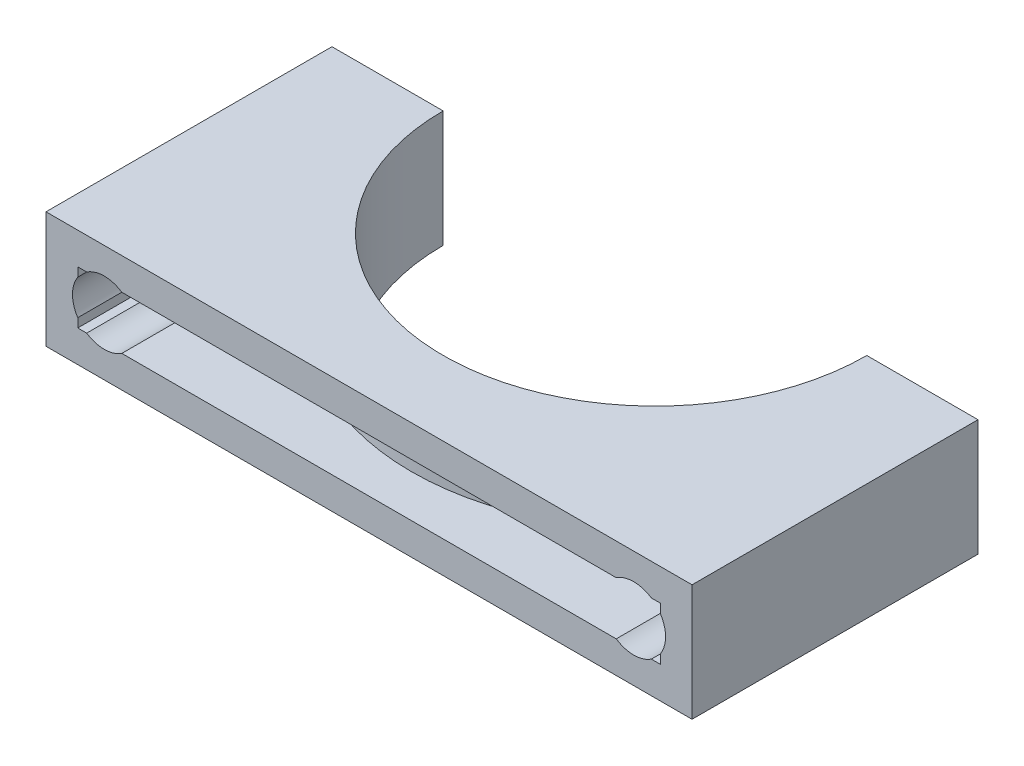
ISO-10303-21;
HEADER;
FILE_DESCRIPTION(('STEP AP214'),'2;1');
FILE_NAME('part.step','',(''),(''),'','','');
FILE_SCHEMA(('AUTOMOTIVE_DESIGN { 1 0 10303 214 1 1 1 1 }'));
ENDSEC;
DATA;
#1=APPLICATION_CONTEXT('core data for automotive mechanical design processes');
#2=APPLICATION_PROTOCOL_DEFINITION('international standard','automotive_design',2000,#1);
#3=PRODUCT_CONTEXT('',#1,'mechanical');
#4=PRODUCT('Part','Part','',(#3));
#5=PRODUCT_RELATED_PRODUCT_CATEGORY('part','',(#4));
#6=PRODUCT_DEFINITION_FORMATION('','',#4);
#7=PRODUCT_DEFINITION_CONTEXT('part definition',#1,'design');
#8=PRODUCT_DEFINITION('design','',#6,#7);
#9=PRODUCT_DEFINITION_SHAPE('','',#8);
#10=(LENGTH_UNIT() NAMED_UNIT(*) SI_UNIT(.MILLI.,.METRE.));
#11=(NAMED_UNIT(*) PLANE_ANGLE_UNIT() SI_UNIT($,.RADIAN.));
#12=(NAMED_UNIT(*) SI_UNIT($,.STERADIAN.) SOLID_ANGLE_UNIT());
#13=UNCERTAINTY_MEASURE_WITH_UNIT(LENGTH_MEASURE(1.E-05),#10,'distance_accuracy_value','');
#14=(GEOMETRIC_REPRESENTATION_CONTEXT(3) GLOBAL_UNCERTAINTY_ASSIGNED_CONTEXT((#13)) GLOBAL_UNIT_ASSIGNED_CONTEXT((#10,
#11,#12)) REPRESENTATION_CONTEXT('',''));
#15=CARTESIAN_POINT('',(0.,0.,0.));
#16=DIRECTION('',(0.,0.,1.));
#17=DIRECTION('',(1.,0.,0.));
#18=AXIS2_PLACEMENT_3D('',#15,#16,#17);
#19=CARTESIAN_POINT('',(-13.75,-2.75,-5.25));
#20=DIRECTION('',(0.,0.,1.));
#21=DIRECTION('',(1.,0.,0.));
#22=AXIS2_PLACEMENT_3D('',#19,#20,#21);
#23=PLANE('',#22);
#24=DIRECTION('',(1.,0.,0.));
#25=VECTOR('',#24,1.);
#26=CARTESIAN_POINT('',(13.75,-1.25,-5.25));
#27=LINE('',#26,#25);
#28=CARTESIAN_POINT('',(-11.4017542509914,-1.25,-5.25));
#29=VERTEX_POINT('',#28);
#30=CARTESIAN_POINT('',(-11.6708438024111,-1.24999999999999,-5.25));
#31=VERTEX_POINT('',#30);
#32=EDGE_CURVE('E430',#29,#31,#27,.F.);
#33=ORIENTED_EDGE('',*,*,#32,.F.);
#34=DIRECTION('',(0.,1.,0.));
#35=VECTOR('',#34,1.);
#36=CARTESIAN_POINT('',(-11.4017542509914,-2.75,-5.25));
#37=LINE('',#36,#35);
#38=CARTESIAN_POINT('',(-11.4017542509914,-1.02169284757431,-5.25));
#39=VERTEX_POINT('',#38);
#40=EDGE_CURVE('E483',#39,#29,#37,.F.);
#41=ORIENTED_EDGE('',*,*,#40,.F.);
#42=CARTESIAN_POINT('',(-12.5,0.,-5.25));
#43=DIRECTION('',(0.,0.,1.));
#44=DIRECTION('',(1.,0.,0.));
#45=AXIS2_PLACEMENT_3D('',#42,#43,#44);
#46=CIRCLE('',#45,1.5);
#47=EDGE_CURVE('E428',#39,#31,#46,.F.);
#48=ORIENTED_EDGE('',*,*,#47,.T.);
#49=EDGE_LOOP('',(#33,#41,#48));
#50=FACE_BOUND('',#49,.T.);
#51=ADVANCED_FACE('F16',(#50),#23,.T.);
#52=CARTESIAN_POINT('',(13.75,-1.25,-6.75));
#53=DIRECTION('',(0.,1.,0.));
#54=DIRECTION('',(0.,0.,1.));
#55=AXIS2_PLACEMENT_3D('',#52,#53,#54);
#56=PLANE('',#55);
#57=DIRECTION('',(0.,0.,-1.));
#58=VECTOR('',#57,1.);
#59=CARTESIAN_POINT('',(-13.75,-1.25,5.25));
#60=LINE('',#59,#58);
#61=CARTESIAN_POINT('',(-13.75,-1.25,6.75));
#62=VERTEX_POINT('',#61);
#63=CARTESIAN_POINT('',(-13.75,-1.25,-5.25));
#64=VERTEX_POINT('',#63);
#65=EDGE_CURVE('E180',#62,#64,#60,.T.);
#66=ORIENTED_EDGE('',*,*,#65,.F.);
#67=DIRECTION('',(1.,0.,0.));
#68=VECTOR('',#67,1.);
#69=CARTESIAN_POINT('',(13.75,-1.25,6.75));
#70=LINE('',#69,#68);
#71=CARTESIAN_POINT('',(-13.3291561975889,-1.24999999999999,6.75));
#72=VERTEX_POINT('',#71);
#73=EDGE_CURVE('E194',#62,#72,#70,.T.);
#74=ORIENTED_EDGE('',*,*,#73,.T.);
#75=DIRECTION('',(0.,0.,1.));
#76=VECTOR('',#75,1.);
#77=CARTESIAN_POINT('',(-13.3291561975889,-1.24999999999998,-6.75));
#78=LINE('',#77,#76);
#79=CARTESIAN_POINT('',(-13.3291561975889,-1.24999999999999,-5.25));
#80=VERTEX_POINT('',#79);
#81=EDGE_CURVE('E427',#72,#80,#78,.F.);
#82=ORIENTED_EDGE('',*,*,#81,.T.);
#83=DIRECTION('',(1.,0.,0.));
#84=VECTOR('',#83,1.);
#85=CARTESIAN_POINT('',(-13.75,-1.25,-5.25));
#86=LINE('',#85,#84);
#87=EDGE_CURVE('E191',#64,#80,#86,.T.);
#88=ORIENTED_EDGE('',*,*,#87,.F.);
#89=EDGE_LOOP('',(#66,#74,#82,#88));
#90=FACE_BOUND('',#89,.T.);
#91=ADVANCED_FACE('F204',(#90),#56,.T.);
#92=CARTESIAN_POINT('',(-13.75,-2.75,-5.25));
#93=DIRECTION('',(0.,0.,1.));
#94=DIRECTION('',(1.,0.,0.));
#95=AXIS2_PLACEMENT_3D('',#92,#93,#94);
#96=PLANE('',#95);
#97=DIRECTION('',(0.,1.,0.));
#98=VECTOR('',#97,1.);
#99=CARTESIAN_POINT('',(-13.75,-2.75,-5.25));
#100=LINE('',#99,#98);
#101=CARTESIAN_POINT('',(-13.75,-0.829156197588849,-5.25));
#102=VERTEX_POINT('',#101);
#103=EDGE_CURVE('E206',#64,#102,#100,.T.);
#104=ORIENTED_EDGE('',*,*,#103,.F.);
#105=ORIENTED_EDGE('',*,*,#87,.T.);
#106=CARTESIAN_POINT('',(-12.5,0.,-5.25));
#107=DIRECTION('',(0.,0.,1.));
#108=DIRECTION('',(1.,0.,0.));
#109=AXIS2_PLACEMENT_3D('',#106,#107,#108);
#110=CIRCLE('',#109,1.5);
#111=EDGE_CURVE('E420',#80,#102,#110,.F.);
#112=ORIENTED_EDGE('',*,*,#111,.T.);
#113=EDGE_LOOP('',(#104,#105,#112));
#114=FACE_BOUND('',#113,.T.);
#115=ADVANCED_FACE('F606',(#114),#96,.T.);
#116=CARTESIAN_POINT('',(-13.75,-2.75,5.25));
#117=DIRECTION('',(1.,0.,0.));
#118=DIRECTION('',(0.,0.,-1.));
#119=AXIS2_PLACEMENT_3D('',#116,#117,#118);
#120=PLANE('',#119);
#121=ORIENTED_EDGE('',*,*,#65,.T.);
#122=ORIENTED_EDGE('',*,*,#103,.T.);
#123=DIRECTION('',(0.,0.,1.));
#124=VECTOR('',#123,1.);
#125=CARTESIAN_POINT('',(-13.75,-0.829156197588847,-6.75));
#126=LINE('',#125,#124);
#127=CARTESIAN_POINT('',(-13.75,-0.82915619758885,6.75));
#128=VERTEX_POINT('',#127);
#129=EDGE_CURVE('E187',#102,#128,#126,.T.);
#130=ORIENTED_EDGE('',*,*,#129,.T.);
#131=DIRECTION('',(0.,1.,0.));
#132=VECTOR('',#131,1.);
#133=CARTESIAN_POINT('',(-13.75,-2.75,6.75));
#134=LINE('',#133,#132);
#135=EDGE_CURVE('E183',#128,#62,#134,.F.);
#136=ORIENTED_EDGE('',*,*,#135,.T.);
#137=EDGE_LOOP('',(#121,#122,#130,#136));
#138=FACE_BOUND('',#137,.T.);
#139=ADVANCED_FACE('F185',(#138),#120,.T.);
#140=CARTESIAN_POINT('',(-13.75,-2.75,5.25));
#141=DIRECTION('',(1.,0.,0.));
#142=DIRECTION('',(0.,0.,-1.));
#143=AXIS2_PLACEMENT_3D('',#140,#141,#142);
#144=PLANE('',#143);
#145=DIRECTION('',(0.,0.,-1.));
#146=VECTOR('',#145,1.);
#147=CARTESIAN_POINT('',(-13.75,1.25,-6.75));
#148=LINE('',#147,#146);
#149=CARTESIAN_POINT('',(-13.75,1.25,6.75));
#150=VERTEX_POINT('',#149);
#151=CARTESIAN_POINT('',(-13.75,1.25,-5.25));
#152=VERTEX_POINT('',#151);
#153=EDGE_CURVE('E505',#150,#152,#148,.T.);
#154=ORIENTED_EDGE('',*,*,#153,.F.);
#155=DIRECTION('',(0.,1.,0.));
#156=VECTOR('',#155,1.);
#157=CARTESIAN_POINT('',(-13.75,-2.75,6.75));
#158=LINE('',#157,#156);
#159=CARTESIAN_POINT('',(-13.75,0.829156197588852,6.75));
#160=VERTEX_POINT('',#159);
#161=EDGE_CURVE('E208',#150,#160,#158,.F.);
#162=ORIENTED_EDGE('',*,*,#161,.T.);
#163=DIRECTION('',(0.,0.,1.));
#164=VECTOR('',#163,1.);
#165=CARTESIAN_POINT('',(-13.75,0.829156197588849,-6.75));
#166=LINE('',#165,#164);
#167=CARTESIAN_POINT('',(-13.75,0.82915619758885,-5.25));
#168=VERTEX_POINT('',#167);
#169=EDGE_CURVE('E419',#160,#168,#166,.F.);
#170=ORIENTED_EDGE('',*,*,#169,.T.);
#171=DIRECTION('',(0.,1.,0.));
#172=VECTOR('',#171,1.);
#173=CARTESIAN_POINT('',(-13.75,-2.75,-5.25));
#174=LINE('',#173,#172);
#175=EDGE_CURVE('E506',#152,#168,#174,.F.);
#176=ORIENTED_EDGE('',*,*,#175,.F.);
#177=EDGE_LOOP('',(#154,#162,#170,#176));
#178=FACE_BOUND('',#177,.T.);
#179=ADVANCED_FACE('F539',(#178),#144,.T.);
#180=CARTESIAN_POINT('',(-13.75,-2.75,-5.25));
#181=DIRECTION('',(0.,0.,1.));
#182=DIRECTION('',(1.,0.,0.));
#183=AXIS2_PLACEMENT_3D('',#180,#181,#182);
#184=PLANE('',#183);
#185=DIRECTION('',(1.,0.,0.));
#186=VECTOR('',#185,1.);
#187=CARTESIAN_POINT('',(-13.75,1.25,-5.25));
#188=LINE('',#187,#186);
#189=CARTESIAN_POINT('',(-13.3291561975889,1.24999999999999,-5.25));
#190=VERTEX_POINT('',#189);
#191=EDGE_CURVE('E500',#152,#190,#188,.T.);
#192=ORIENTED_EDGE('',*,*,#191,.F.);
#193=ORIENTED_EDGE('',*,*,#175,.T.);
#194=CARTESIAN_POINT('',(-12.5,0.,-5.25));
#195=DIRECTION('',(0.,0.,1.));
#196=DIRECTION('',(1.,0.,0.));
#197=AXIS2_PLACEMENT_3D('',#194,#195,#196);
#198=CIRCLE('',#197,1.5);
#199=EDGE_CURVE('E423',#168,#190,#198,.F.);
#200=ORIENTED_EDGE('',*,*,#199,.T.);
#201=EDGE_LOOP('',(#192,#193,#200));
#202=FACE_BOUND('',#201,.T.);
#203=ADVANCED_FACE('F544',(#202),#184,.T.);
#204=CARTESIAN_POINT('',(-13.75,1.25,-6.75));
#205=DIRECTION('',(0.,-1.,0.));
#206=DIRECTION('',(0.,0.,-1.));
#207=AXIS2_PLACEMENT_3D('',#204,#205,#206);
#208=PLANE('',#207);
#209=ORIENTED_EDGE('',*,*,#153,.T.);
#210=ORIENTED_EDGE('',*,*,#191,.T.);
#211=DIRECTION('',(0.,0.,1.));
#212=VECTOR('',#211,1.);
#213=CARTESIAN_POINT('',(-13.3291561975889,1.24999999999998,-6.75));
#214=LINE('',#213,#212);
#215=CARTESIAN_POINT('',(-13.3291561975889,1.24999999999999,6.75));
#216=VERTEX_POINT('',#215);
#217=EDGE_CURVE('E453',#190,#216,#214,.T.);
#218=ORIENTED_EDGE('',*,*,#217,.T.);
#219=DIRECTION('',(1.,0.,0.));
#220=VECTOR('',#219,1.);
#221=CARTESIAN_POINT('',(-13.75,1.25,6.75));
#222=LINE('',#221,#220);
#223=EDGE_CURVE('E503',#216,#150,#222,.F.);
#224=ORIENTED_EDGE('',*,*,#223,.T.);
#225=EDGE_LOOP('',(#209,#210,#218,#224));
#226=FACE_BOUND('',#225,.T.);
#227=ADVANCED_FACE('F535',(#226),#208,.T.);
#228=CARTESIAN_POINT('',(-13.75,-2.75,-5.25));
#229=DIRECTION('',(0.,0.,1.));
#230=DIRECTION('',(1.,0.,0.));
#231=AXIS2_PLACEMENT_3D('',#228,#229,#230);
#232=PLANE('',#231);
#233=DIRECTION('',(0.,1.,0.));
#234=VECTOR('',#233,1.);
#235=CARTESIAN_POINT('',(-11.4017542509914,-2.75,-5.25));
#236=LINE('',#235,#234);
#237=CARTESIAN_POINT('',(-11.4017542509914,1.25,-5.25));
#238=VERTEX_POINT('',#237);
#239=CARTESIAN_POINT('',(-11.4017542509914,1.02169284757431,-5.25));
#240=VERTEX_POINT('',#239);
#241=EDGE_CURVE('E479',#238,#240,#236,.F.);
#242=ORIENTED_EDGE('',*,*,#241,.F.);
#243=DIRECTION('',(1.,0.,0.));
#244=VECTOR('',#243,1.);
#245=CARTESIAN_POINT('',(-13.75,1.25,-5.25));
#246=LINE('',#245,#244);
#247=CARTESIAN_POINT('',(-11.6708438024111,1.24999999999999,-5.25));
#248=VERTEX_POINT('',#247);
#249=EDGE_CURVE('E150',#248,#238,#246,.T.);
#250=ORIENTED_EDGE('',*,*,#249,.F.);
#251=CARTESIAN_POINT('',(-12.5,0.,-5.25));
#252=DIRECTION('',(0.,0.,1.));
#253=DIRECTION('',(1.,0.,0.));
#254=AXIS2_PLACEMENT_3D('',#251,#252,#253);
#255=CIRCLE('',#254,1.5);
#256=EDGE_CURVE('E289',#248,#240,#255,.F.);
#257=ORIENTED_EDGE('',*,*,#256,.T.);
#258=EDGE_LOOP('',(#242,#250,#257));
#259=FACE_BOUND('',#258,.T.);
#260=ADVANCED_FACE('F586',(#259),#232,.T.);
#261=CARTESIAN_POINT('',(13.75,-2.75,-5.25));
#262=DIRECTION('',(-1.,0.,0.));
#263=DIRECTION('',(0.,0.,1.));
#264=AXIS2_PLACEMENT_3D('',#261,#262,#263);
#265=PLANE('',#264);
#266=DIRECTION('',(0.,0.,1.));
#267=VECTOR('',#266,1.);
#268=CARTESIAN_POINT('',(13.75,-1.25,-6.75));
#269=LINE('',#268,#267);
#270=CARTESIAN_POINT('',(13.75,-1.25,6.75));
#271=VERTEX_POINT('',#270);
#272=CARTESIAN_POINT('',(13.75,-1.25,-5.25));
#273=VERTEX_POINT('',#272);
#274=EDGE_CURVE('E488',#271,#273,#269,.F.);
#275=ORIENTED_EDGE('',*,*,#274,.F.);
#276=DIRECTION('',(0.,1.,0.));
#277=VECTOR('',#276,1.);
#278=CARTESIAN_POINT('',(13.75,-2.75,6.75));
#279=LINE('',#278,#277);
#280=CARTESIAN_POINT('',(13.75,-0.829156197588851,6.75));
#281=VERTEX_POINT('',#280);
#282=EDGE_CURVE('E496',#271,#281,#279,.T.);
#283=ORIENTED_EDGE('',*,*,#282,.T.);
#284=DIRECTION('',(0.,0.,1.));
#285=VECTOR('',#284,1.);
#286=CARTESIAN_POINT('',(13.75,-0.829156197588852,-6.75));
#287=LINE('',#286,#285);
#288=CARTESIAN_POINT('',(13.75,-0.829156197588852,-5.25));
#289=VERTEX_POINT('',#288);
#290=EDGE_CURVE('E288',#281,#289,#287,.F.);
#291=ORIENTED_EDGE('',*,*,#290,.T.);
#292=DIRECTION('',(0.,1.,0.));
#293=VECTOR('',#292,1.);
#294=CARTESIAN_POINT('',(13.75,-2.75,-5.25));
#295=LINE('',#294,#293);
#296=EDGE_CURVE('E489',#273,#289,#295,.T.);
#297=ORIENTED_EDGE('',*,*,#296,.F.);
#298=EDGE_LOOP('',(#275,#283,#291,#297));
#299=FACE_BOUND('',#298,.T.);
#300=ADVANCED_FACE('F588',(#299),#265,.T.);
#301=CARTESIAN_POINT('',(11.4017542509914,-2.75,-5.25));
#302=DIRECTION('',(0.,0.,1.));
#303=DIRECTION('',(1.,0.,0.));
#304=AXIS2_PLACEMENT_3D('',#301,#302,#303);
#305=PLANE('',#304);
#306=DIRECTION('',(1.,0.,0.));
#307=VECTOR('',#306,1.);
#308=CARTESIAN_POINT('',(13.75,-1.25,-5.25));
#309=LINE('',#308,#307);
#310=CARTESIAN_POINT('',(13.3291561975889,-1.24999999999999,-5.25));
#311=VERTEX_POINT('',#310);
#312=EDGE_CURVE('E485',#273,#311,#309,.F.);
#313=ORIENTED_EDGE('',*,*,#312,.F.);
#314=ORIENTED_EDGE('',*,*,#296,.T.);
#315=CARTESIAN_POINT('',(12.5,0.,-5.25));
#316=DIRECTION('',(0.,0.,1.));
#317=DIRECTION('',(1.,0.,0.));
#318=AXIS2_PLACEMENT_3D('',#315,#316,#317);
#319=CIRCLE('',#318,1.5);
#320=EDGE_CURVE('E290',#289,#311,#319,.F.);
#321=ORIENTED_EDGE('',*,*,#320,.T.);
#322=EDGE_LOOP('',(#313,#314,#321));
#323=FACE_BOUND('',#322,.T.);
#324=ADVANCED_FACE('F594',(#323),#305,.T.);
#325=CARTESIAN_POINT('',(13.75,-1.25,-6.75));
#326=DIRECTION('',(0.,1.,0.));
#327=DIRECTION('',(0.,0.,1.));
#328=AXIS2_PLACEMENT_3D('',#325,#326,#327);
#329=PLANE('',#328);
#330=ORIENTED_EDGE('',*,*,#274,.T.);
#331=ORIENTED_EDGE('',*,*,#312,.T.);
#332=DIRECTION('',(0.,0.,1.));
#333=VECTOR('',#332,1.);
#334=CARTESIAN_POINT('',(13.3291561975889,-1.24999999999998,-6.75));
#335=LINE('',#334,#333);
#336=CARTESIAN_POINT('',(13.3291561975889,-1.24999999999999,6.75));
#337=VERTEX_POINT('',#336);
#338=EDGE_CURVE('E436',#311,#337,#335,.T.);
#339=ORIENTED_EDGE('',*,*,#338,.T.);
#340=DIRECTION('',(1.,0.,0.));
#341=VECTOR('',#340,1.);
#342=CARTESIAN_POINT('',(13.75,-1.25,6.75));
#343=LINE('',#342,#341);
#344=EDGE_CURVE('E486',#337,#271,#343,.T.);
#345=ORIENTED_EDGE('',*,*,#344,.T.);
#346=EDGE_LOOP('',(#330,#331,#339,#345));
#347=FACE_BOUND('',#346,.T.);
#348=ADVANCED_FACE('F673',(#347),#329,.T.);
#349=CARTESIAN_POINT('',(11.4017542509914,-2.75,-5.25));
#350=DIRECTION('',(0.,0.,1.));
#351=DIRECTION('',(1.,0.,0.));
#352=AXIS2_PLACEMENT_3D('',#349,#350,#351);
#353=PLANE('',#352);
#354=DIRECTION('',(0.,1.,0.));
#355=VECTOR('',#354,1.);
#356=CARTESIAN_POINT('',(11.4017542509914,-2.75,-5.25));
#357=LINE('',#356,#355);
#358=CARTESIAN_POINT('',(11.4017542509914,-1.25,-5.25));
#359=VERTEX_POINT('',#358);
#360=CARTESIAN_POINT('',(11.4017542509914,-1.02169284757431,-5.25));
#361=VERTEX_POINT('',#360);
#362=EDGE_CURVE('E481',#359,#361,#357,.T.);
#363=ORIENTED_EDGE('',*,*,#362,.F.);
#364=DIRECTION('',(1.,0.,0.));
#365=VECTOR('',#364,1.);
#366=CARTESIAN_POINT('',(13.75,-1.25,-5.25));
#367=LINE('',#366,#365);
#368=CARTESIAN_POINT('',(11.6708438024112,-1.25000000000001,-5.25));
#369=VERTEX_POINT('',#368);
#370=EDGE_CURVE('E433',#369,#359,#367,.F.);
#371=ORIENTED_EDGE('',*,*,#370,.F.);
#372=CARTESIAN_POINT('',(12.5,0.,-5.25));
#373=DIRECTION('',(0.,0.,1.));
#374=DIRECTION('',(1.,0.,0.));
#375=AXIS2_PLACEMENT_3D('',#372,#373,#374);
#376=CIRCLE('',#375,1.5);
#377=EDGE_CURVE('E265',#369,#361,#376,.F.);
#378=ORIENTED_EDGE('',*,*,#377,.T.);
#379=EDGE_LOOP('',(#363,#371,#378));
#380=FACE_BOUND('',#379,.T.);
#381=ADVANCED_FACE('F277',(#380),#353,.T.);
#382=CARTESIAN_POINT('',(0.,-2.75,-6.75));
#383=DIRECTION('',(0.,1.,0.));
#384=DIRECTION('',(0.,0.,1.));
#385=AXIS2_PLACEMENT_3D('',#382,#383,#384);
#386=CYLINDRICAL_SURFACE('',#385,11.5);
#387=ORIENTED_EDGE('',*,*,#241,.T.);
#388=CARTESIAN_POINT('',(-11.4017542509914,1.02169284757431,-5.25));
#389=CARTESIAN_POINT('',(-11.395151931792,1.01459345203071,-5.19981381459754));
#390=CARTESIAN_POINT('',(-11.388226924947,1.00701455327788,-5.14973953345198));
#391=CARTESIAN_POINT('',(-11.3737428237699,0.990789390126812,-5.04984637754065));
#392=CARTESIAN_POINT('',(-11.366183604968,0.982142916049173,-5.00002755495637));
#393=CARTESIAN_POINT('',(-11.3424989279683,0.954353940819139,-4.85054698047975));
#394=CARTESIAN_POINT('',(-11.3254310573734,0.933428984496436,-4.75135139917861));
#395=CARTESIAN_POINT('',(-11.2887886129209,0.885376214714339,-4.55376243632158));
#396=CARTESIAN_POINT('',(-11.2691890550378,0.858184113484657,-4.45538915455844));
#397=CARTESIAN_POINT('',(-11.2280139345665,0.795903862862529,-4.26173954466052));
#398=CARTESIAN_POINT('',(-11.2064430728953,0.760834221715053,-4.16645654690945));
#399=CARTESIAN_POINT('',(-11.1723007680438,0.69844329388978,-4.02376641349822));
#400=CARTESIAN_POINT('',(-11.1601702149158,0.67501515193527,-3.97455782798645));
#401=CARTESIAN_POINT('',(-11.135758558967,0.624214931300915,-3.87818087993045));
#402=CARTESIAN_POINT('',(-11.1234773767428,0.59684068281474,-3.83101365852557));
#403=CARTESIAN_POINT('',(-11.0990199818145,0.536949079792107,-3.73934796067291));
#404=CARTESIAN_POINT('',(-11.0868457140689,0.504387576835951,-3.69487738232958));
#405=CARTESIAN_POINT('',(-11.0633756616711,0.433035373458389,-3.61095656131306));
#406=CARTESIAN_POINT('',(-11.0520772866718,0.394264168731251,-3.57149127722606));
#407=CARTESIAN_POINT('',(-11.0361729627533,0.32830687537718,-3.51684298648235));
#408=CARTESIAN_POINT('',(-11.030841883881,0.303748862607518,-3.4987199588348));
#409=CARTESIAN_POINT('',(-11.0211240476921,0.252214386186391,-3.46593012255932));
#410=CARTESIAN_POINT('',(-11.0167367127937,0.225239416142983,-3.4512611994573));
#411=CARTESIAN_POINT('',(-11.0098116407744,0.173008160438236,-3.42822745954767));
#412=CARTESIAN_POINT('',(-11.0071008746116,0.148040693778399,-3.41926730599731));
#413=CARTESIAN_POINT('',(-11.0029170009968,0.0969224241800866,-3.40547141439067));
#414=CARTESIAN_POINT('',(-11.0014403556713,0.0707752318886455,-3.40062388599907));
#415=CARTESIAN_POINT('',(-11.0002195241324,0.0296565740841546,-3.3966179794072));
#416=CARTESIAN_POINT('',(-10.9999988049177,0.0148334310350462,-3.39589443085824));
#417=CARTESIAN_POINT('',(-11.0000022595184,-0.0280452729952311,-3.39590484566642));
#418=CARTESIAN_POINT('',(-11.0007977896994,-0.0561273221581873,-3.39851098494879));
#419=CARTESIAN_POINT('',(-11.0038801939069,-0.111342236396071,-3.40864605990669));
#420=CARTESIAN_POINT('',(-11.0061715011658,-0.13847202645724,-3.41618962947321));
#421=CARTESIAN_POINT('',(-11.0119507644909,-0.190777458206183,-3.43532994715448));
#422=CARTESIAN_POINT('',(-11.0154264598448,-0.215970002268597,-3.4468851888764));
#423=CARTESIAN_POINT('',(-11.0232849985302,-0.264415442333751,-3.47320620513292));
#424=CARTESIAN_POINT('',(-11.0276676754527,-0.287668693053245,-3.48797139074582));
#425=CARTESIAN_POINT('',(-11.0408765556233,-0.350226208042539,-3.53286776910595));
#426=CARTESIAN_POINT('',(-11.0504369338274,-0.38736011136234,-3.56579144437242));
#427=CARTESIAN_POINT('',(-11.0706050572992,-0.456204235473187,-3.63662955060036));
#428=CARTESIAN_POINT('',(-11.0812165706575,-0.487893741852065,-3.67456211190914));
#429=CARTESIAN_POINT('',(-11.1027189495593,-0.546408472632976,-3.75312324846259));
#430=CARTESIAN_POINT('',(-11.1136047189571,-0.573289145704807,-3.79371255692157));
#431=CARTESIAN_POINT('',(-11.1354396116272,-0.623474367822597,-3.877048521917));
#432=CARTESIAN_POINT('',(-11.1463887886271,-0.646775203003646,-3.91979735856827));
#433=CARTESIAN_POINT('',(-11.1790839658312,-0.712465790826148,-4.05071124055861));
#434=CARTESIAN_POINT('',(-11.200575247876,-0.750390257925208,-4.14117380835631));
#435=CARTESIAN_POINT('',(-11.2397242104854,-0.814204430179044,-4.31570731514192));
#436=CARTESIAN_POINT('',(-11.2575473054523,-0.840940690026096,-4.39944884754221));
#437=CARTESIAN_POINT('',(-11.2915901118237,-0.889166995128312,-4.56884046766065));
#438=CARTESIAN_POINT('',(-11.307808109241,-0.910651467532311,-4.65449247842078));
#439=CARTESIAN_POINT('',(-11.3380209978214,-0.948886035063107,-4.82475767279629));
#440=CARTESIAN_POINT('',(-11.3520633934891,-0.96574645434998,-4.90933828424949));
#441=CARTESIAN_POINT('',(-11.3783021891978,-0.996079153434886,-5.07918333583628));
#442=CARTESIAN_POINT('',(-11.3905028475302,-1.00955929806809,-5.16444570324225));
#443=CARTESIAN_POINT('',(-11.4017542509914,-1.02169284757431,-5.25));
#444=B_SPLINE_CURVE_WITH_KNOTS('',3,(#388,#389,#390,#391,#392,#393,#394,#395,#396,#397,#398,
#399,#400,#401,#402,#403,#404,#405,#406,#407,#408,#409,#410,#411,#412,#413,#414,#415,#416,#417,
#418,#419,#420,#421,#422,#423,#424,#425,#426,#427,#428,#429,#430,#431,#432,#433,#434,#435,#436,
#437,#438,#439,#440,#441,#442,#443),.UNSPECIFIED.,.F.,.F.,(4,2,2,2,2,2,2,2,2,2,2,2,2,2,2,2,2,2,
2,2,2,2,2,2,2,2,2,4),(0.,0.153334293623671,0.30669875124457,0.614923099650224,0.926462209755546,
1.23727687715594,1.40465311006707,1.57212173004107,1.74110036885327,1.909558530472,
2.00228132916384,2.09494721798478,2.17462836747556,2.25408030254399,2.29854959535947,
2.38262680271433,2.46695433915108,2.55043418271473,2.63389872331146,2.78464085896684,
2.93594440167634,3.08537162642828,3.2349528410253,3.53548220008354,3.80438035067005,
4.0735626115563,4.3356152379531,4.5970523717931),.UNSPECIFIED.);
#445=EDGE_CURVE('E283',#240,#39,#444,.T.);
#446=ORIENTED_EDGE('',*,*,#445,.T.);
#447=ORIENTED_EDGE('',*,*,#40,.T.);
#448=CARTESIAN_POINT('',(0.,-1.25,-6.75));
#449=DIRECTION('',(0.,1.,0.));
#450=DIRECTION('',(0.,0.,1.));
#451=AXIS2_PLACEMENT_3D('',#448,#449,#450);
#452=CIRCLE('',#451,11.5);
#453=EDGE_CURVE('E432',#359,#29,#452,.F.);
#454=ORIENTED_EDGE('',*,*,#453,.F.);
#455=ORIENTED_EDGE('',*,*,#362,.T.);
#456=CARTESIAN_POINT('',(11.4017542509914,-1.02169284757431,-5.25));
#457=CARTESIAN_POINT('',(11.3952837772762,-1.01473529389521,-5.20081601571849));
#458=CARTESIAN_POINT('',(11.3885033701188,-1.00731708573464,-5.15173944468576));
#459=CARTESIAN_POINT('',(11.3743333524532,-0.991457656887303,-5.05383126606635));
#460=CARTESIAN_POINT('',(11.3669436319586,-0.983016251374388,-5.0049997044011));
#461=CARTESIAN_POINT('',(11.3438052871048,-0.955920920905907,-4.8584700927996));
#462=CARTESIAN_POINT('',(11.327150732589,-0.935561668277343,-4.76121715030409));
#463=CARTESIAN_POINT('',(11.290693786642,-0.887989207179637,-4.5634822255123));
#464=CARTESIAN_POINT('',(11.2707731198567,-0.860475907395073,-4.46309347820781));
#465=CARTESIAN_POINT('',(11.2288631243011,-0.79728794411012,-4.26549487082919));
#466=CARTESIAN_POINT('',(11.2068787759285,-0.761632646379492,-4.16827808346384));
#467=CARTESIAN_POINT('',(11.1748730297272,-0.703142866339916,-4.03451635228256));
#468=CARTESIAN_POINT('',(11.1653843283549,-0.685025940279417,-3.9957770542862));
#469=CARTESIAN_POINT('',(11.1462825919614,-0.646463924218173,-3.91946518613114));
#470=CARTESIAN_POINT('',(11.1366694935088,-0.626017601339134,-3.88189324733373));
#471=CARTESIAN_POINT('',(11.117571784644,-0.58262176084189,-3.80873972309885));
#472=CARTESIAN_POINT('',(11.1080868932481,-0.559701107991242,-3.77314124786403));
#473=CARTESIAN_POINT('',(11.0893678019593,-0.510691259177821,-3.70415129868536));
#474=CARTESIAN_POINT('',(11.0801333079959,-0.484605996187269,-3.67075716333785));
#475=CARTESIAN_POINT('',(11.0640299633342,-0.434214649691177,-3.61345040643808));
#476=CARTESIAN_POINT('',(11.0570563339175,-0.410589409234241,-3.58897424597654));
#477=CARTESIAN_POINT('',(11.0437388597687,-0.360521154985459,-3.54275661562875));
#478=CARTESIAN_POINT('',(11.0373960132279,-0.334073808200729,-3.52101946605812));
#479=CARTESIAN_POINT('',(11.0256644341475,-0.27779725412213,-3.48118369534205));
#480=CARTESIAN_POINT('',(11.0202886160767,-0.247929913369337,-3.46313394085822));
#481=CARTESIAN_POINT('',(11.0111480307538,-0.185234813213139,-3.43264019597923));
#482=CARTESIAN_POINT('',(11.0073782668347,-0.152416625985494,-3.42017881288866));
#483=CARTESIAN_POINT('',(11.0027689033958,-0.0943040681399516,-3.40498573144656));
#484=CARTESIAN_POINT('',(11.0014018396733,-0.0695108382095728,-3.40049806710049));
#485=CARTESIAN_POINT('',(10.9999185877041,-0.0194881695748863,-3.39562995632633));
#486=CARTESIAN_POINT('',(10.9998015976964,0.00574097914086342,-3.39524687733574));
#487=CARTESIAN_POINT('',(11.0008310599553,0.055867015066212,-3.39862438366942));
#488=CARTESIAN_POINT('',(11.0019765388835,0.0807641432882108,-3.402381776772));
#489=CARTESIAN_POINT('',(11.0054081085316,0.129600671005573,-3.41368068701717));
#490=CARTESIAN_POINT('',(11.0076952221601,0.15353919076808,-3.42122559782359));
#491=CARTESIAN_POINT('',(11.0142312893504,0.208611425493526,-3.442904914573));
#492=CARTESIAN_POINT('',(11.0188927742278,0.239139601001545,-3.45844362624206));
#493=CARTESIAN_POINT('',(11.0294456860625,0.297231701200951,-3.49397887145195));
#494=CARTESIAN_POINT('',(11.0353398632636,0.324788785171659,-3.51398537992027));
#495=CARTESIAN_POINT('',(11.0520287347887,0.394165369520013,-3.57131654644856));
#496=CARTESIAN_POINT('',(11.0635054628539,0.433511387693729,-3.61140427646062));
#497=CARTESIAN_POINT('',(11.0873456779138,0.505823897207416,-3.69668213706042));
#498=CARTESIAN_POINT('',(11.0997115079023,0.538772617757268,-3.74188594392589));
#499=CARTESIAN_POINT('',(11.1251523626519,0.600797865281008,-3.83735146440109));
#500=CARTESIAN_POINT('',(11.1382360248234,0.629668073351249,-3.88774288109662));
#501=CARTESIAN_POINT('',(11.1642244605695,0.68306973876185,-3.99084659184845));
#502=CARTESIAN_POINT('',(11.1771290203152,0.707596362685255,-4.04356139087526));
#503=CARTESIAN_POINT('',(11.2025514372128,0.753199822533965,-4.15079042305563));
#504=CARTESIAN_POINT('',(11.2150675871695,0.774262810493314,-4.20531088011688));
#505=CARTESIAN_POINT('',(11.2395089162689,0.813445986979196,-4.31553316197433));
#506=CARTESIAN_POINT('',(11.251433940418,0.831565406506085,-4.37123529119608));
#507=CARTESIAN_POINT('',(11.2768967823126,0.868689846487496,-4.4947119540485));
#508=CARTESIAN_POINT('',(11.2902824249977,0.887151782061767,-4.56268020515481));
#509=CARTESIAN_POINT('',(11.3159449403274,0.921121588161222,-4.69957460299936));
#510=CARTESIAN_POINT('',(11.3282214130841,0.936628395494363,-4.76850108495522));
#511=CARTESIAN_POINT('',(11.3513947186832,0.96490223399924,-4.90592529627684));
#512=CARTESIAN_POINT('',(11.3623109096883,0.977710104333333,-4.97441145494698));
#513=CARTESIAN_POINT('',(11.3829413343814,1.00120691577977,-5.11186618670255));
#514=CARTESIAN_POINT('',(11.3926565883211,1.01189766020288,-5.18083429697576));
#515=CARTESIAN_POINT('',(11.4017542509914,1.0216928475745,-5.24999999999994));
#516=B_SPLINE_CURVE_WITH_KNOTS('',3,(#456,#457,#458,#459,#460,#461,#462,#463,#464,#465,#466,
#467,#468,#469,#470,#471,#472,#473,#474,#475,#476,#477,#478,#479,#480,#481,#482,#483,#484,#485,
#486,#487,#488,#489,#490,#491,#492,#493,#494,#495,#496,#497,#498,#499,#500,#501,#502,#503,#504,
#505,#506,#507,#508,#509,#510,#511,#512,#513,#514,#515),.UNSPECIFIED.,.F.,.F.,(4,2,2,2,2,2,2,2,
2,2,2,2,2,2,2,2,2,2,2,2,2,2,2,2,2,2,2,2,2,4),(0.,0.150272660885047,0.300572506968888,
0.602636489096841,0.920327347807125,1.23727030630376,1.36863065104785,1.50006084664532,
1.63009638055666,1.75997193094192,1.86397362295187,1.9681373590382,2.07360285853585,
2.17873780007452,2.25410048919087,2.32941483995938,2.40467116546054,2.47999504226241,
2.58312115117276,2.68647984598073,2.85750385799729,3.02899635891679,3.20731461803677,
3.3858300746143,3.56504275841114,3.74430218602816,3.95928442252809,4.17434385962486,
4.38586884570893,4.5972128781539),.UNSPECIFIED.);
#517=CARTESIAN_POINT('',(11.4017542509914,1.02169284757432,-5.25));
#518=VERTEX_POINT('',#517);
#519=EDGE_CURVE('E257',#361,#518,#516,.T.);
#520=ORIENTED_EDGE('',*,*,#519,.T.);
#521=DIRECTION('',(0.,1.,0.));
#522=VECTOR('',#521,1.);
#523=CARTESIAN_POINT('',(11.4017542509914,-2.75,-5.25));
#524=LINE('',#523,#522);
#525=CARTESIAN_POINT('',(11.4017542509914,1.25,-5.25));
#526=VERTEX_POINT('',#525);
#527=EDGE_CURVE('E475',#526,#518,#524,.F.);
#528=ORIENTED_EDGE('',*,*,#527,.F.);
#529=CARTESIAN_POINT('',(0.,1.25,-6.75));
#530=DIRECTION('',(0.,1.,0.));
#531=DIRECTION('',(0.,0.,1.));
#532=AXIS2_PLACEMENT_3D('',#529,#530,#531);
#533=CIRCLE('',#532,11.5);
#534=EDGE_CURVE('E19',#238,#526,#533,.T.);
#535=ORIENTED_EDGE('',*,*,#534,.F.);
#536=EDGE_LOOP('',(#387,#446,#447,#454,#455,#520,#528,#535));
#537=FACE_BOUND('',#536,.T.);
#538=ADVANCED_FACE('F271',(#537),#386,.T.);
#539=CARTESIAN_POINT('',(11.4017542509914,-2.75,-5.25));
#540=DIRECTION('',(0.,0.,1.));
#541=DIRECTION('',(1.,0.,0.));
#542=AXIS2_PLACEMENT_3D('',#539,#540,#541);
#543=PLANE('',#542);
#544=DIRECTION('',(1.,0.,0.));
#545=VECTOR('',#544,1.);
#546=CARTESIAN_POINT('',(-13.75,1.25,-5.25));
#547=LINE('',#546,#545);
#548=CARTESIAN_POINT('',(11.6708438024111,1.24999999999999,-5.25));
#549=VERTEX_POINT('',#548);
#550=EDGE_CURVE('E435',#526,#549,#547,.T.);
#551=ORIENTED_EDGE('',*,*,#550,.F.);
#552=ORIENTED_EDGE('',*,*,#527,.T.);
#553=CARTESIAN_POINT('',(12.5,0.,-5.25));
#554=DIRECTION('',(0.,0.,1.));
#555=DIRECTION('',(1.,0.,0.));
#556=AXIS2_PLACEMENT_3D('',#553,#554,#555);
#557=CIRCLE('',#556,1.5);
#558=EDGE_CURVE('E253',#518,#549,#557,.F.);
#559=ORIENTED_EDGE('',*,*,#558,.T.);
#560=EDGE_LOOP('',(#551,#552,#559));
#561=FACE_BOUND('',#560,.T.);
#562=ADVANCED_FACE('F276',(#561),#543,.T.);
#563=CARTESIAN_POINT('',(-13.75,1.25,-6.75));
#564=DIRECTION('',(0.,-1.,0.));
#565=DIRECTION('',(0.,0.,-1.));
#566=AXIS2_PLACEMENT_3D('',#563,#564,#565);
#567=PLANE('',#566);
#568=DIRECTION('',(0.,0.,1.));
#569=VECTOR('',#568,1.);
#570=CARTESIAN_POINT('',(13.75,1.25,-5.25));
#571=LINE('',#570,#569);
#572=CARTESIAN_POINT('',(13.75,1.25,6.75));
#573=VERTEX_POINT('',#572);
#574=CARTESIAN_POINT('',(13.75,1.25,-5.25));
#575=VERTEX_POINT('',#574);
#576=EDGE_CURVE('E158',#573,#575,#571,.F.);
#577=ORIENTED_EDGE('',*,*,#576,.F.);
#578=DIRECTION('',(1.,0.,0.));
#579=VECTOR('',#578,1.);
#580=CARTESIAN_POINT('',(-13.75,1.25,6.75));
#581=LINE('',#580,#579);
#582=CARTESIAN_POINT('',(13.3291561975889,1.24999999999999,6.75));
#583=VERTEX_POINT('',#582);
#584=EDGE_CURVE('E471',#573,#583,#581,.F.);
#585=ORIENTED_EDGE('',*,*,#584,.T.);
#586=DIRECTION('',(0.,0.,1.));
#587=VECTOR('',#586,1.);
#588=CARTESIAN_POINT('',(13.3291561975889,1.24999999999998,-6.75));
#589=LINE('',#588,#587);
#590=CARTESIAN_POINT('',(13.3291561975889,1.24999999999999,-5.25));
#591=VERTEX_POINT('',#590);
#592=EDGE_CURVE('E252',#583,#591,#589,.F.);
#593=ORIENTED_EDGE('',*,*,#592,.T.);
#594=DIRECTION('',(1.,0.,0.));
#595=VECTOR('',#594,1.);
#596=CARTESIAN_POINT('',(11.4017542509914,1.25,-5.25));
#597=LINE('',#596,#595);
#598=EDGE_CURVE('E464',#575,#591,#597,.F.);
#599=ORIENTED_EDGE('',*,*,#598,.F.);
#600=EDGE_LOOP('',(#577,#585,#593,#599));
#601=FACE_BOUND('',#600,.T.);
#602=ADVANCED_FACE('F309',(#601),#567,.T.);
#603=CARTESIAN_POINT('',(11.4017542509914,-2.75,-5.25));
#604=DIRECTION('',(0.,0.,1.));
#605=DIRECTION('',(1.,0.,0.));
#606=AXIS2_PLACEMENT_3D('',#603,#604,#605);
#607=PLANE('',#606);
#608=DIRECTION('',(0.,1.,0.));
#609=VECTOR('',#608,1.);
#610=CARTESIAN_POINT('',(13.75,-2.75,-5.25));
#611=LINE('',#610,#609);
#612=CARTESIAN_POINT('',(13.75,0.829156197588851,-5.25));
#613=VERTEX_POINT('',#612);
#614=EDGE_CURVE('E452',#575,#613,#611,.F.);
#615=ORIENTED_EDGE('',*,*,#614,.F.);
#616=ORIENTED_EDGE('',*,*,#598,.T.);
#617=CARTESIAN_POINT('',(12.5,0.,-5.25));
#618=DIRECTION('',(0.,0.,1.));
#619=DIRECTION('',(1.,0.,0.));
#620=AXIS2_PLACEMENT_3D('',#617,#618,#619);
#621=CIRCLE('',#620,1.5);
#622=EDGE_CURVE('E248',#591,#613,#621,.F.);
#623=ORIENTED_EDGE('',*,*,#622,.T.);
#624=EDGE_LOOP('',(#615,#616,#623));
#625=FACE_BOUND('',#624,.T.);
#626=ADVANCED_FACE('F307',(#625),#607,.T.);
#627=CARTESIAN_POINT('',(13.75,-2.75,-5.25));
#628=DIRECTION('',(-1.,0.,0.));
#629=DIRECTION('',(0.,0.,1.));
#630=AXIS2_PLACEMENT_3D('',#627,#628,#629);
#631=PLANE('',#630);
#632=ORIENTED_EDGE('',*,*,#576,.T.);
#633=ORIENTED_EDGE('',*,*,#614,.T.);
#634=DIRECTION('',(0.,0.,1.));
#635=VECTOR('',#634,1.);
#636=CARTESIAN_POINT('',(13.75,0.829156197588852,-6.75));
#637=LINE('',#636,#635);
#638=CARTESIAN_POINT('',(13.75,0.82915619758885,6.75));
#639=VERTEX_POINT('',#638);
#640=EDGE_CURVE('E251',#613,#639,#637,.T.);
#641=ORIENTED_EDGE('',*,*,#640,.T.);
#642=DIRECTION('',(0.,1.,0.));
#643=VECTOR('',#642,1.);
#644=CARTESIAN_POINT('',(13.75,-2.75,6.75));
#645=LINE('',#644,#643);
#646=EDGE_CURVE('E462',#639,#573,#645,.T.);
#647=ORIENTED_EDGE('',*,*,#646,.T.);
#648=EDGE_LOOP('',(#632,#633,#641,#647));
#649=FACE_BOUND('',#648,.T.);
#650=ADVANCED_FACE('F304',(#649),#631,.T.);
#651=CARTESIAN_POINT('',(-13.75,1.25,-6.75));
#652=DIRECTION('',(0.,-1.,0.));
#653=DIRECTION('',(0.,0.,-1.));
#654=AXIS2_PLACEMENT_3D('',#651,#652,#653);
#655=PLANE('',#654);
#656=DIRECTION('',(0.,0.,1.));
#657=VECTOR('',#656,1.);
#658=CARTESIAN_POINT('',(11.6708438024111,1.24999999999998,-6.75));
#659=LINE('',#658,#657);
#660=CARTESIAN_POINT('',(11.6708438024111,1.24999999999999,6.75));
#661=VERTEX_POINT('',#660);
#662=EDGE_CURVE('E256',#549,#661,#659,.T.);
#663=ORIENTED_EDGE('',*,*,#662,.T.);
#664=DIRECTION('',(1.,0.,0.));
#665=VECTOR('',#664,1.);
#666=CARTESIAN_POINT('',(-15.25,1.25,6.75));
#667=LINE('',#666,#665);
#668=CARTESIAN_POINT('',(-11.6708438024111,1.24999999999999,6.75));
#669=VERTEX_POINT('',#668);
#670=EDGE_CURVE('E238',#669,#661,#667,.T.);
#671=ORIENTED_EDGE('',*,*,#670,.F.);
#672=DIRECTION('',(0.,0.,1.));
#673=VECTOR('',#672,1.);
#674=CARTESIAN_POINT('',(-11.6708438024111,1.24999999999998,-6.75));
#675=LINE('',#674,#673);
#676=EDGE_CURVE('E456',#669,#248,#675,.F.);
#677=ORIENTED_EDGE('',*,*,#676,.T.);
#678=ORIENTED_EDGE('',*,*,#249,.T.);
#679=ORIENTED_EDGE('',*,*,#534,.T.);
#680=ORIENTED_EDGE('',*,*,#550,.T.);
#681=EDGE_LOOP('',(#663,#671,#677,#678,#679,#680));
#682=FACE_BOUND('',#681,.T.);
#683=ADVANCED_FACE('F300',(#682),#655,.T.);
#684=CARTESIAN_POINT('',(13.75,-1.25,-6.75));
#685=DIRECTION('',(0.,1.,0.));
#686=DIRECTION('',(0.,0.,1.));
#687=AXIS2_PLACEMENT_3D('',#684,#685,#686);
#688=PLANE('',#687);
#689=ORIENTED_EDGE('',*,*,#453,.T.);
#690=ORIENTED_EDGE('',*,*,#32,.T.);
#691=DIRECTION('',(0.,0.,1.));
#692=VECTOR('',#691,1.);
#693=CARTESIAN_POINT('',(-11.6708438024111,-1.24999999999998,-6.75));
#694=LINE('',#693,#692);
#695=CARTESIAN_POINT('',(-11.6708438024111,-1.24999999999999,6.75));
#696=VERTEX_POINT('',#695);
#697=EDGE_CURVE('E424',#31,#696,#694,.T.);
#698=ORIENTED_EDGE('',*,*,#697,.T.);
#699=DIRECTION('',(1.,0.,0.));
#700=VECTOR('',#699,1.);
#701=CARTESIAN_POINT('',(-15.25,-1.25,6.75));
#702=LINE('',#701,#700);
#703=CARTESIAN_POINT('',(11.6708438024112,-1.25000000000001,6.75));
#704=VERTEX_POINT('',#703);
#705=EDGE_CURVE('E228',#704,#696,#702,.F.);
#706=ORIENTED_EDGE('',*,*,#705,.F.);
#707=DIRECTION('',(0.,0.,1.));
#708=VECTOR('',#707,1.);
#709=CARTESIAN_POINT('',(11.6708438024112,-1.25000000000002,-6.75));
#710=LINE('',#709,#708);
#711=EDGE_CURVE('E439',#704,#369,#710,.F.);
#712=ORIENTED_EDGE('',*,*,#711,.T.);
#713=ORIENTED_EDGE('',*,*,#370,.T.);
#714=EDGE_LOOP('',(#689,#690,#698,#706,#712,#713));
#715=FACE_BOUND('',#714,.T.);
#716=ADVANCED_FACE('F296',(#715),#688,.T.);
#717=CARTESIAN_POINT('',(-12.5,0.,-6.75));
#718=DIRECTION('',(0.,0.,1.));
#719=DIRECTION('',(1.,0.,0.));
#720=AXIS2_PLACEMENT_3D('',#717,#718,#719);
#721=CYLINDRICAL_SURFACE('',#720,1.5);
#722=CARTESIAN_POINT('',(-12.5,0.,-6.75));
#723=DIRECTION('',(0.,0.,1.));
#724=DIRECTION('',(1.,0.,0.));
#725=AXIS2_PLACEMENT_3D('',#722,#723,#724);
#726=CIRCLE('',#725,1.5);
#727=CARTESIAN_POINT('',(-11.,0.,-6.75));
#728=VERTEX_POINT('',#727);
#729=EDGE_CURVE('E243',#728,#728,#726,.T.);
#730=ORIENTED_EDGE('',*,*,#729,.F.);
#731=EDGE_LOOP('',(#730));
#732=FACE_BOUND('',#731,.T.);
#733=ORIENTED_EDGE('',*,*,#256,.F.);
#734=ORIENTED_EDGE('',*,*,#676,.F.);
#735=CARTESIAN_POINT('',(-12.5,0.,6.75));
#736=DIRECTION('',(0.,0.,1.));
#737=DIRECTION('',(1.,0.,0.));
#738=AXIS2_PLACEMENT_3D('',#735,#736,#737);
#739=CIRCLE('',#738,1.5);
#740=EDGE_CURVE('E239',#216,#669,#739,.F.);
#741=ORIENTED_EDGE('',*,*,#740,.F.);
#742=ORIENTED_EDGE('',*,*,#217,.F.);
#743=ORIENTED_EDGE('',*,*,#199,.F.);
#744=ORIENTED_EDGE('',*,*,#169,.F.);
#745=CARTESIAN_POINT('',(-12.5,0.,6.75));
#746=DIRECTION('',(0.,0.,1.));
#747=DIRECTION('',(1.,0.,0.));
#748=AXIS2_PLACEMENT_3D('',#745,#746,#747);
#749=CIRCLE('',#748,1.5);
#750=EDGE_CURVE('E224',#128,#160,#749,.F.);
#751=ORIENTED_EDGE('',*,*,#750,.F.);
#752=ORIENTED_EDGE('',*,*,#129,.F.);
#753=ORIENTED_EDGE('',*,*,#111,.F.);
#754=ORIENTED_EDGE('',*,*,#81,.F.);
#755=CARTESIAN_POINT('',(-12.5,0.,6.75));
#756=DIRECTION('',(0.,0.,1.));
#757=DIRECTION('',(1.,0.,0.));
#758=AXIS2_PLACEMENT_3D('',#755,#756,#757);
#759=CIRCLE('',#758,1.5);
#760=EDGE_CURVE('E199',#696,#72,#759,.F.);
#761=ORIENTED_EDGE('',*,*,#760,.F.);
#762=ORIENTED_EDGE('',*,*,#697,.F.);
#763=ORIENTED_EDGE('',*,*,#47,.F.);
#764=ORIENTED_EDGE('',*,*,#445,.F.);
#765=EDGE_LOOP('',(#733,#734,#741,#742,#743,#744,#751,#752,#753,#754,#761,#762,#763,#764));
#766=FACE_BOUND('',#765,.T.);
#767=ADVANCED_FACE('F292',(#732,#766),#721,.F.);
#768=CARTESIAN_POINT('',(12.5,0.,-6.75));
#769=DIRECTION('',(0.,0.,1.));
#770=DIRECTION('',(1.,0.,0.));
#771=AXIS2_PLACEMENT_3D('',#768,#769,#770);
#772=CYLINDRICAL_SURFACE('',#771,1.5);
#773=CARTESIAN_POINT('',(12.5,0.,-6.75));
#774=DIRECTION('',(0.,0.,1.));
#775=DIRECTION('',(1.,0.,0.));
#776=AXIS2_PLACEMENT_3D('',#773,#774,#775);
#777=CIRCLE('',#776,1.5);
#778=CARTESIAN_POINT('',(14.,0.,-6.75));
#779=VERTEX_POINT('',#778);
#780=EDGE_CURVE('E220',#779,#779,#777,.T.);
#781=ORIENTED_EDGE('',*,*,#780,.F.);
#782=EDGE_LOOP('',(#781));
#783=FACE_BOUND('',#782,.T.);
#784=ORIENTED_EDGE('',*,*,#640,.F.);
#785=ORIENTED_EDGE('',*,*,#622,.F.);
#786=ORIENTED_EDGE('',*,*,#592,.F.);
#787=CARTESIAN_POINT('',(12.5,0.,6.75));
#788=DIRECTION('',(0.,0.,1.));
#789=DIRECTION('',(1.,0.,0.));
#790=AXIS2_PLACEMENT_3D('',#787,#788,#789);
#791=CIRCLE('',#790,1.5);
#792=EDGE_CURVE('E235',#661,#583,#791,.F.);
#793=ORIENTED_EDGE('',*,*,#792,.F.);
#794=ORIENTED_EDGE('',*,*,#662,.F.);
#795=ORIENTED_EDGE('',*,*,#558,.F.);
#796=ORIENTED_EDGE('',*,*,#519,.F.);
#797=ORIENTED_EDGE('',*,*,#377,.F.);
#798=ORIENTED_EDGE('',*,*,#711,.F.);
#799=CARTESIAN_POINT('',(12.5,0.,6.75));
#800=DIRECTION('',(0.,0.,1.));
#801=DIRECTION('',(1.,0.,0.));
#802=AXIS2_PLACEMENT_3D('',#799,#800,#801);
#803=CIRCLE('',#802,1.5);
#804=EDGE_CURVE('E229',#337,#704,#803,.F.);
#805=ORIENTED_EDGE('',*,*,#804,.F.);
#806=ORIENTED_EDGE('',*,*,#338,.F.);
#807=ORIENTED_EDGE('',*,*,#320,.F.);
#808=ORIENTED_EDGE('',*,*,#290,.F.);
#809=CARTESIAN_POINT('',(12.5,0.,6.75));
#810=DIRECTION('',(0.,0.,1.));
#811=DIRECTION('',(1.,0.,0.));
#812=AXIS2_PLACEMENT_3D('',#809,#810,#811);
#813=CIRCLE('',#812,1.5);
#814=EDGE_CURVE('E232',#639,#281,#813,.F.);
#815=ORIENTED_EDGE('',*,*,#814,.F.);
#816=EDGE_LOOP('',(#784,#785,#786,#793,#794,#795,#796,#797,#798,#805,#806,#807,#808,#815));
#817=FACE_BOUND('',#816,.T.);
#818=ADVANCED_FACE('F267',(#783,#817),#772,.F.);
#819=CARTESIAN_POINT('',(0.,2.75,0.));
#820=DIRECTION('',(0.,1.,0.));
#821=DIRECTION('',(0.,0.,1.));
#822=AXIS2_PLACEMENT_3D('',#819,#820,#821);
#823=PLANE('',#822);
#824=DIRECTION('',(0.,0.,-1.));
#825=VECTOR('',#824,1.);
#826=CARTESIAN_POINT('',(15.25,2.75,6.75));
#827=LINE('',#826,#825);
#828=CARTESIAN_POINT('',(15.25,2.75,-6.75));
#829=VERTEX_POINT('',#828);
#830=CARTESIAN_POINT('',(15.25,2.75,6.75));
#831=VERTEX_POINT('',#830);
#832=EDGE_CURVE('E226',#829,#831,#827,.F.);
#833=ORIENTED_EDGE('',*,*,#832,.F.);
#834=DIRECTION('',(1.,0.,0.));
#835=VECTOR('',#834,1.);
#836=CARTESIAN_POINT('',(-10.,2.75,-6.75));
#837=LINE('',#836,#835);
#838=CARTESIAN_POINT('',(10.,2.75,-6.75));
#839=VERTEX_POINT('',#838);
#840=EDGE_CURVE('E359',#839,#829,#837,.T.);
#841=ORIENTED_EDGE('',*,*,#840,.F.);
#842=CARTESIAN_POINT('',(0.,2.75,-6.75));
#843=DIRECTION('',(0.,-1.,0.));
#844=DIRECTION('',(0.,0.,-1.));
#845=AXIS2_PLACEMENT_3D('',#842,#843,#844);
#846=CIRCLE('',#845,10.);
#847=CARTESIAN_POINT('',(-10.,2.75,-6.75));
#848=VERTEX_POINT('',#847);
#849=EDGE_CURVE('E216',#839,#848,#846,.T.);
#850=ORIENTED_EDGE('',*,*,#849,.T.);
#851=DIRECTION('',(1.,0.,0.));
#852=VECTOR('',#851,1.);
#853=CARTESIAN_POINT('',(-10.,2.75,-6.75));
#854=LINE('',#853,#852);
#855=CARTESIAN_POINT('',(-15.25,2.75,-6.75));
#856=VERTEX_POINT('',#855);
#857=EDGE_CURVE('E247',#856,#848,#854,.T.);
#858=ORIENTED_EDGE('',*,*,#857,.F.);
#859=DIRECTION('',(0.,0.,1.));
#860=VECTOR('',#859,1.);
#861=CARTESIAN_POINT('',(-15.25,2.75,-6.75));
#862=LINE('',#861,#860);
#863=CARTESIAN_POINT('',(-15.25,2.75,6.75));
#864=VERTEX_POINT('',#863);
#865=EDGE_CURVE('E246',#864,#856,#862,.F.);
#866=ORIENTED_EDGE('',*,*,#865,.F.);
#867=DIRECTION('',(1.,0.,0.));
#868=VECTOR('',#867,1.);
#869=CARTESIAN_POINT('',(-15.25,2.75,6.75));
#870=LINE('',#869,#868);
#871=EDGE_CURVE('E362',#831,#864,#870,.F.);
#872=ORIENTED_EDGE('',*,*,#871,.F.);
#873=EDGE_LOOP('',(#833,#841,#850,#858,#866,#872));
#874=FACE_BOUND('',#873,.T.);
#875=ADVANCED_FACE('F345',(#874),#823,.T.);
#876=CARTESIAN_POINT('',(-10.,-2.75,-6.75));
#877=DIRECTION('',(0.,0.,-1.));
#878=DIRECTION('',(0.,1.,0.));
#879=AXIS2_PLACEMENT_3D('',#876,#877,#878);
#880=PLANE('',#879);
#881=ORIENTED_EDGE('',*,*,#729,.T.);
#882=EDGE_LOOP('',(#881));
#883=FACE_BOUND('',#882,.T.);
#884=DIRECTION('',(0.,1.,0.));
#885=VECTOR('',#884,1.);
#886=CARTESIAN_POINT('',(-15.25,-2.75,-6.75));
#887=LINE('',#886,#885);
#888=CARTESIAN_POINT('',(-15.25,-2.75,-6.75));
#889=VERTEX_POINT('',#888);
#890=EDGE_CURVE('E403',#856,#889,#887,.F.);
#891=ORIENTED_EDGE('',*,*,#890,.F.);
#892=ORIENTED_EDGE('',*,*,#857,.T.);
#893=DIRECTION('',(0.,-1.,0.));
#894=VECTOR('',#893,1.);
#895=CARTESIAN_POINT('',(-10.,-2.75,-6.75));
#896=LINE('',#895,#894);
#897=CARTESIAN_POINT('',(-10.,-2.75,-6.75));
#898=VERTEX_POINT('',#897);
#899=EDGE_CURVE('E219',#848,#898,#896,.T.);
#900=ORIENTED_EDGE('',*,*,#899,.T.);
#901=DIRECTION('',(1.,0.,0.));
#902=VECTOR('',#901,1.);
#903=CARTESIAN_POINT('',(0.,-2.75,-6.75));
#904=LINE('',#903,#902);
#905=EDGE_CURVE('E400',#898,#889,#904,.F.);
#906=ORIENTED_EDGE('',*,*,#905,.T.);
#907=EDGE_LOOP('',(#891,#892,#900,#906));
#908=FACE_BOUND('',#907,.T.);
#909=ADVANCED_FACE('F342',(#883,#908),#880,.T.);
#910=CARTESIAN_POINT('',(-15.25,-2.75,-6.75));
#911=DIRECTION('',(-1.,0.,0.));
#912=DIRECTION('',(0.,0.,1.));
#913=AXIS2_PLACEMENT_3D('',#910,#911,#912);
#914=PLANE('',#913);
#915=ORIENTED_EDGE('',*,*,#865,.T.);
#916=ORIENTED_EDGE('',*,*,#890,.T.);
#917=DIRECTION('',(0.,0.,1.));
#918=VECTOR('',#917,1.);
#919=CARTESIAN_POINT('',(-15.25,-2.75,0.));
#920=LINE('',#919,#918);
#921=CARTESIAN_POINT('',(-15.25,-2.75,6.75));
#922=VERTEX_POINT('',#921);
#923=EDGE_CURVE('E389',#889,#922,#920,.T.);
#924=ORIENTED_EDGE('',*,*,#923,.T.);
#925=DIRECTION('',(0.,1.,0.));
#926=VECTOR('',#925,1.);
#927=CARTESIAN_POINT('',(-15.25,-2.75,6.75));
#928=LINE('',#927,#926);
#929=EDGE_CURVE('E242',#864,#922,#928,.F.);
#930=ORIENTED_EDGE('',*,*,#929,.F.);
#931=EDGE_LOOP('',(#915,#916,#924,#930));
#932=FACE_BOUND('',#931,.T.);
#933=ADVANCED_FACE('F339',(#932),#914,.T.);
#934=CARTESIAN_POINT('',(-15.25,-2.75,6.75));
#935=DIRECTION('',(0.,0.,1.));
#936=DIRECTION('',(1.,0.,0.));
#937=AXIS2_PLACEMENT_3D('',#934,#935,#936);
#938=PLANE('',#937);
#939=ORIENTED_EDGE('',*,*,#161,.F.);
#940=ORIENTED_EDGE('',*,*,#223,.F.);
#941=ORIENTED_EDGE('',*,*,#740,.T.);
#942=ORIENTED_EDGE('',*,*,#670,.T.);
#943=ORIENTED_EDGE('',*,*,#792,.T.);
#944=ORIENTED_EDGE('',*,*,#584,.F.);
#945=ORIENTED_EDGE('',*,*,#646,.F.);
#946=ORIENTED_EDGE('',*,*,#814,.T.);
#947=ORIENTED_EDGE('',*,*,#282,.F.);
#948=ORIENTED_EDGE('',*,*,#344,.F.);
#949=ORIENTED_EDGE('',*,*,#804,.T.);
#950=ORIENTED_EDGE('',*,*,#705,.T.);
#951=ORIENTED_EDGE('',*,*,#760,.T.);
#952=ORIENTED_EDGE('',*,*,#73,.F.);
#953=ORIENTED_EDGE('',*,*,#135,.F.);
#954=ORIENTED_EDGE('',*,*,#750,.T.);
#955=EDGE_LOOP('',(#939,#940,#941,#942,#943,#944,#945,#946,#947,#948,#949,#950,#951,#952,#953,#954));
#956=FACE_BOUND('',#955,.T.);
#957=ORIENTED_EDGE('',*,*,#871,.T.);
#958=ORIENTED_EDGE('',*,*,#929,.T.);
#959=DIRECTION('',(1.,0.,0.));
#960=VECTOR('',#959,1.);
#961=CARTESIAN_POINT('',(0.,-2.75,6.75));
#962=LINE('',#961,#960);
#963=CARTESIAN_POINT('',(15.25,-2.75,6.75));
#964=VERTEX_POINT('',#963);
#965=EDGE_CURVE('E381',#922,#964,#962,.T.);
#966=ORIENTED_EDGE('',*,*,#965,.T.);
#967=DIRECTION('',(0.,1.,0.));
#968=VECTOR('',#967,1.);
#969=CARTESIAN_POINT('',(15.25,-2.75,6.75));
#970=LINE('',#969,#968);
#971=EDGE_CURVE('E366',#831,#964,#970,.F.);
#972=ORIENTED_EDGE('',*,*,#971,.F.);
#973=EDGE_LOOP('',(#957,#958,#966,#972));
#974=FACE_BOUND('',#973,.T.);
#975=ADVANCED_FACE('F196',(#956,#974),#938,.T.);
#976=CARTESIAN_POINT('',(15.25,-2.75,6.75));
#977=DIRECTION('',(1.,0.,0.));
#978=DIRECTION('',(0.,0.,-1.));
#979=AXIS2_PLACEMENT_3D('',#976,#977,#978);
#980=PLANE('',#979);
#981=ORIENTED_EDGE('',*,*,#832,.T.);
#982=ORIENTED_EDGE('',*,*,#971,.T.);
#983=DIRECTION('',(0.,0.,1.));
#984=VECTOR('',#983,1.);
#985=CARTESIAN_POINT('',(15.25,-2.75,0.));
#986=LINE('',#985,#984);
#987=CARTESIAN_POINT('',(15.25,-2.75,-6.75));
#988=VERTEX_POINT('',#987);
#989=EDGE_CURVE('E370',#964,#988,#986,.F.);
#990=ORIENTED_EDGE('',*,*,#989,.T.);
#991=DIRECTION('',(0.,1.,0.));
#992=VECTOR('',#991,1.);
#993=CARTESIAN_POINT('',(15.25,-2.75,-6.75));
#994=LINE('',#993,#992);
#995=EDGE_CURVE('E223',#829,#988,#994,.F.);
#996=ORIENTED_EDGE('',*,*,#995,.F.);
#997=EDGE_LOOP('',(#981,#982,#990,#996));
#998=FACE_BOUND('',#997,.T.);
#999=ADVANCED_FACE('F332',(#998),#980,.T.);
#1000=CARTESIAN_POINT('',(-10.,-2.75,-6.75));
#1001=DIRECTION('',(0.,0.,-1.));
#1002=DIRECTION('',(0.,1.,0.));
#1003=AXIS2_PLACEMENT_3D('',#1000,#1001,#1002);
#1004=PLANE('',#1003);
#1005=ORIENTED_EDGE('',*,*,#780,.T.);
#1006=EDGE_LOOP('',(#1005));
#1007=FACE_BOUND('',#1006,.T.);
#1008=DIRECTION('',(1.,0.,0.));
#1009=VECTOR('',#1008,1.);
#1010=CARTESIAN_POINT('',(0.,-2.75,-6.75));
#1011=LINE('',#1010,#1009);
#1012=CARTESIAN_POINT('',(10.,-2.75,-6.75));
#1013=VERTEX_POINT('',#1012);
#1014=EDGE_CURVE('E25',#988,#1013,#1011,.F.);
#1015=ORIENTED_EDGE('',*,*,#1014,.T.);
#1016=DIRECTION('',(0.,-1.,0.));
#1017=VECTOR('',#1016,1.);
#1018=CARTESIAN_POINT('',(10.,-2.75,-6.75));
#1019=LINE('',#1018,#1017);
#1020=EDGE_CURVE('E33',#1013,#839,#1019,.F.);
#1021=ORIENTED_EDGE('',*,*,#1020,.T.);
#1022=ORIENTED_EDGE('',*,*,#840,.T.);
#1023=ORIENTED_EDGE('',*,*,#995,.T.);
#1024=EDGE_LOOP('',(#1015,#1021,#1022,#1023));
#1025=FACE_BOUND('',#1024,.T.);
#1026=ADVANCED_FACE('F326',(#1007,#1025),#1004,.T.);
#1027=CARTESIAN_POINT('',(0.,-2.75,-6.75));
#1028=DIRECTION('',(0.,-1.,0.));
#1029=DIRECTION('',(0.,0.,-1.));
#1030=AXIS2_PLACEMENT_3D('',#1027,#1028,#1029);
#1031=CYLINDRICAL_SURFACE('',#1030,10.);
#1032=CARTESIAN_POINT('',(0.,-2.75,-6.75));
#1033=DIRECTION('',(0.,-1.,0.));
#1034=DIRECTION('',(0.,0.,-1.));
#1035=AXIS2_PLACEMENT_3D('',#1032,#1033,#1034);
#1036=CIRCLE('',#1035,10.);
#1037=EDGE_CURVE('E11',#1013,#898,#1036,.T.);
#1038=ORIENTED_EDGE('',*,*,#1037,.T.);
#1039=ORIENTED_EDGE('',*,*,#899,.F.);
#1040=ORIENTED_EDGE('',*,*,#849,.F.);
#1041=ORIENTED_EDGE('',*,*,#1020,.F.);
#1042=EDGE_LOOP('',(#1038,#1039,#1040,#1041));
#1043=FACE_BOUND('',#1042,.T.);
#1044=ADVANCED_FACE('F320',(#1043),#1031,.F.);
#1045=CARTESIAN_POINT('',(0.,-2.75,0.));
#1046=DIRECTION('',(0.,1.,0.));
#1047=DIRECTION('',(0.,0.,1.));
#1048=AXIS2_PLACEMENT_3D('',#1045,#1046,#1047);
#1049=PLANE('',#1048);
#1050=ORIENTED_EDGE('',*,*,#1014,.F.);
#1051=ORIENTED_EDGE('',*,*,#989,.F.);
#1052=ORIENTED_EDGE('',*,*,#965,.F.);
#1053=ORIENTED_EDGE('',*,*,#923,.F.);
#1054=ORIENTED_EDGE('',*,*,#905,.F.);
#1055=ORIENTED_EDGE('',*,*,#1037,.F.);
#1056=EDGE_LOOP('',(#1050,#1051,#1052,#1053,#1054,#1055));
#1057=FACE_BOUND('',#1056,.T.);
#1058=ADVANCED_FACE('F318',(#1057),#1049,.F.);
#1059=CLOSED_SHELL('',(#51,#91,#115,#139,#179,#203,#227,#260,#300,#324,#348,#381,#538,#562,#602,
#626,#650,#683,#716,#767,#818,#875,#909,#933,#975,#999,#1026,#1044,#1058));
#1060=MANIFOLD_SOLID_BREP('B1',#1059);
#1061=ADVANCED_BREP_SHAPE_REPRESENTATION('',(#18,#1060),#14);
#1062=SHAPE_DEFINITION_REPRESENTATION(#9,#1061);
ENDSEC;
END-ISO-10303-21;
